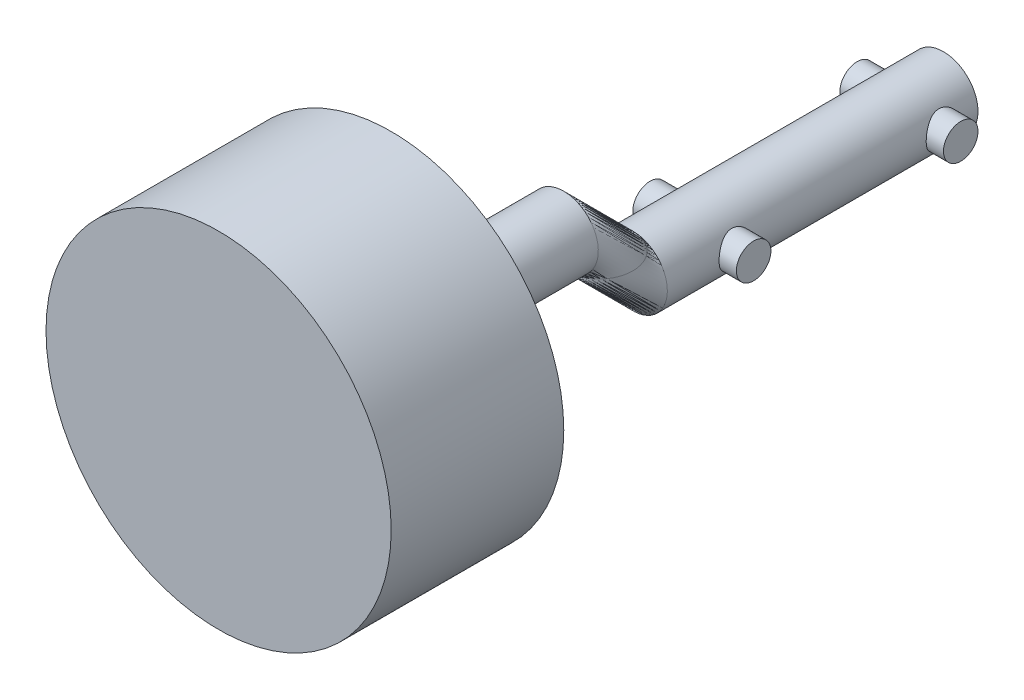
ISO-10303-21;
HEADER;
FILE_DESCRIPTION(('STEP AP214'),'2;1');
FILE_NAME('part.step','',(''),(''),'','','');
FILE_SCHEMA(('AUTOMOTIVE_DESIGN { 1 0 10303 214 1 1 1 1 }'));
ENDSEC;
DATA;
#1=APPLICATION_CONTEXT('core data for automotive mechanical design processes');
#2=APPLICATION_PROTOCOL_DEFINITION('international standard','automotive_design',2000,#1);
#3=PRODUCT_CONTEXT('',#1,'mechanical');
#4=PRODUCT('Part','Part','',(#3));
#5=PRODUCT_RELATED_PRODUCT_CATEGORY('part','',(#4));
#6=PRODUCT_DEFINITION_FORMATION('','',#4);
#7=PRODUCT_DEFINITION_CONTEXT('part definition',#1,'design');
#8=PRODUCT_DEFINITION('design','',#6,#7);
#9=PRODUCT_DEFINITION_SHAPE('','',#8);
#10=(LENGTH_UNIT() NAMED_UNIT(*) SI_UNIT(.MILLI.,.METRE.));
#11=(NAMED_UNIT(*) PLANE_ANGLE_UNIT() SI_UNIT($,.RADIAN.));
#12=(NAMED_UNIT(*) SI_UNIT($,.STERADIAN.) SOLID_ANGLE_UNIT());
#13=UNCERTAINTY_MEASURE_WITH_UNIT(LENGTH_MEASURE(1.E-05),#10,'distance_accuracy_value','');
#14=(GEOMETRIC_REPRESENTATION_CONTEXT(3) GLOBAL_UNCERTAINTY_ASSIGNED_CONTEXT((#13)) GLOBAL_UNIT_ASSIGNED_CONTEXT((#10,
#11,#12)) REPRESENTATION_CONTEXT('',''));
#15=CARTESIAN_POINT('',(0.,0.,0.));
#16=DIRECTION('',(0.,0.,1.));
#17=DIRECTION('',(1.,0.,0.));
#18=AXIS2_PLACEMENT_3D('',#15,#16,#17);
#19=CARTESIAN_POINT('',(0.,0.,10.));
#20=DIRECTION('',(0.,0.,-1.));
#21=DIRECTION('',(-1.,0.,0.));
#22=AXIS2_PLACEMENT_3D('',#19,#20,#21);
#23=CYLINDRICAL_SURFACE('',#22,10.);
#24=CARTESIAN_POINT('',(0.,0.,10.));
#25=DIRECTION('',(0.,0.,1.));
#26=DIRECTION('',(1.,0.,0.));
#27=AXIS2_PLACEMENT_3D('',#24,#25,#26);
#28=CIRCLE('',#27,10.);
#29=CARTESIAN_POINT('',(10.,0.,10.));
#30=VERTEX_POINT('',#29);
#31=EDGE_CURVE('E89',#30,#30,#28,.T.);
#32=ORIENTED_EDGE('',*,*,#31,.F.);
#33=EDGE_LOOP('',(#32));
#34=FACE_BOUND('',#33,.T.);
#35=CARTESIAN_POINT('',(0.,0.,0.));
#36=DIRECTION('',(0.,0.,1.));
#37=DIRECTION('',(1.,0.,0.));
#38=AXIS2_PLACEMENT_3D('',#35,#36,#37);
#39=CIRCLE('',#38,10.);
#40=CARTESIAN_POINT('',(10.,0.,0.));
#41=VERTEX_POINT('',#40);
#42=EDGE_CURVE('E85',#41,#41,#39,.T.);
#43=ORIENTED_EDGE('',*,*,#42,.T.);
#44=EDGE_LOOP('',(#43));
#45=FACE_BOUND('',#44,.T.);
#46=ADVANCED_FACE('F45',(#34,#45),#23,.T.);
#47=CARTESIAN_POINT('',(0.,0.,10.));
#48=DIRECTION('',(0.,0.,1.));
#49=DIRECTION('',(1.,0.,0.));
#50=AXIS2_PLACEMENT_3D('',#47,#48,#49);
#51=PLANE('',#50);
#52=ORIENTED_EDGE('',*,*,#31,.T.);
#53=EDGE_LOOP('',(#52));
#54=FACE_BOUND('',#53,.T.);
#55=ADVANCED_FACE('F129',(#54),#51,.T.);
#56=CARTESIAN_POINT('',(0.,0.,0.));
#57=DIRECTION('',(0.,0.,1.));
#58=DIRECTION('',(1.,0.,0.));
#59=AXIS2_PLACEMENT_3D('',#56,#57,#58);
#60=PLANE('',#59);
#61=CARTESIAN_POINT('',(0.,0.,0.));
#62=DIRECTION('',(0.,0.,-1.));
#63=DIRECTION('',(-1.,0.,0.));
#64=AXIS2_PLACEMENT_3D('',#61,#62,#63);
#65=CIRCLE('',#64,2.);
#66=CARTESIAN_POINT('',(-2.,0.,0.));
#67=VERTEX_POINT('',#66);
#68=EDGE_CURVE('E147',#67,#67,#65,.T.);
#69=ORIENTED_EDGE('',*,*,#68,.F.);
#70=EDGE_LOOP('',(#69));
#71=FACE_BOUND('',#70,.T.);
#72=ORIENTED_EDGE('',*,*,#42,.F.);
#73=EDGE_LOOP('',(#72));
#74=FACE_BOUND('',#73,.T.);
#75=ADVANCED_FACE('F127',(#71,#74),#60,.F.);
#76=CARTESIAN_POINT('',(0.,-4.,-32.));
#77=DIRECTION('',(0.,0.,-1.));
#78=DIRECTION('',(-1.,0.,0.));
#79=AXIS2_PLACEMENT_3D('',#76,#77,#78);
#80=PLANE('',#79);
#81=CARTESIAN_POINT('',(0.,-4.,-32.));
#82=DIRECTION('',(0.,0.,-1.));
#83=DIRECTION('',(-1.,0.,0.));
#84=AXIS2_PLACEMENT_3D('',#81,#82,#83);
#85=CIRCLE('',#84,2.);
#86=CARTESIAN_POINT('',(-2.,-4.,-32.));
#87=VERTEX_POINT('',#86);
#88=EDGE_CURVE('E61',#87,#87,#85,.T.);
#89=ORIENTED_EDGE('',*,*,#88,.T.);
#90=EDGE_LOOP('',(#89));
#91=FACE_BOUND('',#90,.T.);
#92=ADVANCED_FACE('F120',(#91),#80,.T.);
#93=CARTESIAN_POINT('',(0.,0.,0.));
#94=DIRECTION('',(0.,0.,-1.));
#95=DIRECTION('',(-1.,0.,0.));
#96=AXIS2_PLACEMENT_3D('',#93,#94,#95);
#97=CYLINDRICAL_SURFACE('',#96,2.);
#98=CARTESIAN_POINT('',(0.,0.,-10.));
#99=DIRECTION('',(0.,0.,-1.));
#100=DIRECTION('',(-1.,0.,0.));
#101=AXIS2_PLACEMENT_3D('',#98,#99,#100);
#102=CIRCLE('',#101,2.);
#103=CARTESIAN_POINT('',(0.,-2.,-10.));
#104=VERTEX_POINT('',#103);
#105=EDGE_CURVE('E66',#104,#104,#102,.T.);
#106=ORIENTED_EDGE('',*,*,#105,.F.);
#107=EDGE_LOOP('',(#106));
#108=FACE_BOUND('',#107,.T.);
#109=ORIENTED_EDGE('',*,*,#68,.T.);
#110=EDGE_LOOP('',(#109));
#111=FACE_BOUND('',#110,.T.);
#112=ADVANCED_FACE('F116',(#108,#111),#97,.T.);
#113=CARTESIAN_POINT('',(0.,-2.,-10.));
#114=DIRECTION('',(-1.,0.,0.));
#115=DIRECTION('',(0.,0.,1.));
#116=AXIS2_PLACEMENT_3D('',#113,#114,#115);
#117=DEGENERATE_TOROIDAL_SURFACE('',#116,2.,2.,.T.);
#118=CARTESIAN_POINT('',(0.,-2.,-12.));
#119=DIRECTION('',(0.,-1.,0.));
#120=DIRECTION('',(-1.,0.,0.));
#121=AXIS2_PLACEMENT_3D('',#118,#119,#120);
#122=CIRCLE('',#121,2.);
#123=CARTESIAN_POINT('',(0.,-2.,-14.));
#124=VERTEX_POINT('',#123);
#125=EDGE_CURVE('E75',#104,#124,#122,.T.);
#126=ORIENTED_EDGE('',*,*,#125,.F.);
#127=ORIENTED_EDGE('',*,*,#105,.T.);
#128=EDGE_CURVE('E72',#124,#104,#122,.T.);
#129=ORIENTED_EDGE('',*,*,#128,.F.);
#130=EDGE_LOOP('',(#126,#127,#129));
#131=FACE_BOUND('',#130,.T.);
#132=ADVANCED_FACE('F74',(#131),#117,.T.);
#133=CARTESIAN_POINT('',(0.,-2.,-14.));
#134=DIRECTION('',(1.,0.,0.));
#135=DIRECTION('',(0.,0.,-1.));
#136=AXIS2_PLACEMENT_3D('',#133,#134,#135);
#137=DEGENERATE_TOROIDAL_SURFACE('',#136,2.,2.,.T.);
#138=CARTESIAN_POINT('',(0.,-4.,-14.));
#139=DIRECTION('',(0.,0.,-1.));
#140=DIRECTION('',(-1.,0.,0.));
#141=AXIS2_PLACEMENT_3D('',#138,#139,#140);
#142=CIRCLE('',#141,2.);
#143=EDGE_CURVE('E81',#124,#124,#142,.T.);
#144=ORIENTED_EDGE('',*,*,#143,.F.);
#145=ORIENTED_EDGE('',*,*,#128,.T.);
#146=ORIENTED_EDGE('',*,*,#125,.T.);
#147=EDGE_LOOP('',(#144,#145,#146));
#148=FACE_BOUND('',#147,.T.);
#149=ADVANCED_FACE('F80',(#148),#137,.T.);
#150=CARTESIAN_POINT('',(0.,-4.,-14.));
#151=DIRECTION('',(0.,0.,-1.));
#152=DIRECTION('',(0.,1.,0.));
#153=AXIS2_PLACEMENT_3D('',#150,#151,#152);
#154=CYLINDRICAL_SURFACE('',#153,2.);
#155=CARTESIAN_POINT('',(-2.,-4.,-31.));
#156=CARTESIAN_POINT('',(-1.99999713404151,-4.05257196295299,-30.9999966976805));
#157=CARTESIAN_POINT('',(-1.99790491019518,-4.10520659969803,-30.9958299268783));
#158=CARTESIAN_POINT('',(-1.98974156037396,-4.20892023526843,-30.9793471196591));
#159=CARTESIAN_POINT('',(-1.98366287828984,-4.2599960867135,-30.9670156070023));
#160=CARTESIAN_POINT('',(-1.96816279403312,-4.35893354488058,-30.9348061913832));
#161=CARTESIAN_POINT('',(-1.9587543917752,-4.40680680293918,-30.914957615752));
#162=CARTESIAN_POINT('',(-1.93745776515779,-4.49847261680657,-30.8684293786351));
#163=CARTESIAN_POINT('',(-1.9255697363353,-4.54226549399005,-30.8417502557511));
#164=CARTESIAN_POINT('',(-1.89956258258057,-4.62750781776192,-30.7804827505147));
#165=CARTESIAN_POINT('',(-1.88535199127536,-4.66865521112211,-30.7455135207604));
#166=CARTESIAN_POINT('',(-1.85659970246744,-4.74477944486698,-30.669478520753));
#167=CARTESIAN_POINT('',(-1.84205776209035,-4.77975158310677,-30.6284081482276));
#168=CARTESIAN_POINT('',(-1.81298951197347,-4.84525200045028,-30.5375166504766));
#169=CARTESIAN_POINT('',(-1.79855186970132,-4.87522533555164,-30.4872639016541));
#170=CARTESIAN_POINT('',(-1.77285978772321,-4.9261682268907,-30.3816326640138));
#171=CARTESIAN_POINT('',(-1.7616030760699,-4.94714421496634,-30.3262578712772));
#172=CARTESIAN_POINT('',(-1.74457867037808,-4.97813244218859,-30.2153348945781));
#173=CARTESIAN_POINT('',(-1.73852271583713,-4.98872585708044,-30.1599955479326));
#174=CARTESIAN_POINT('',(-1.73181889948528,-5.00042699330885,-30.0480211622205));
#175=CARTESIAN_POINT('',(-1.73116569343288,-5.00154408837308,-29.9913874591288));
#176=CARTESIAN_POINT('',(-1.73510930257248,-4.99468728717229,-29.8857139756846));
#177=CARTESIAN_POINT('',(-1.73908763662013,-4.98778455953682,-29.8365759687769));
#178=CARTESIAN_POINT('',(-1.7507622873385,-4.96693984905693,-29.740278090627));
#179=CARTESIAN_POINT('',(-1.75845978831776,-4.95299562389765,-29.6931188546947));
#180=CARTESIAN_POINT('',(-1.77687476412741,-4.91820978038601,-29.6007708674343));
#181=CARTESIAN_POINT('',(-1.78765840663998,-4.897215067116,-29.5556536012142));
#182=CARTESIAN_POINT('',(-1.81103404281404,-4.849041687668,-29.46936570741));
#183=CARTESIAN_POINT('',(-1.82362684780191,-4.82186024381247,-29.4281968643999));
#184=CARTESIAN_POINT('',(-1.85113157903286,-4.75806605491279,-29.3454787472568));
#185=CARTESIAN_POINT('',(-1.86613510236746,-4.72069445836928,-29.3045431264238));
#186=CARTESIAN_POINT('',(-1.89547623300407,-4.63955557874137,-29.2292645814091));
#187=CARTESIAN_POINT('',(-1.90981351958801,-4.59578525657429,-29.1949248079661));
#188=CARTESIAN_POINT('',(-1.93701987282964,-4.50051650583185,-29.1323143389703));
#189=CARTESIAN_POINT('',(-1.94978984162007,-4.44875359159941,-29.1043995275543));
#190=CARTESIAN_POINT('',(-1.97157881121242,-4.3404662154888,-29.057902970957));
#191=CARTESIAN_POINT('',(-1.98060078943553,-4.28394557626528,-29.0393138149848));
#192=CARTESIAN_POINT('',(-1.99324333741436,-4.1727664916607,-29.0135245962833));
#193=CARTESIAN_POINT('',(-1.99724938301312,-4.11834153054833,-29.0055087642532));
#194=CARTESIAN_POINT('',(-2.00073013459102,-4.00877959994936,-28.9985352688655));
#195=CARTESIAN_POINT('',(-2.00020698721312,-3.9536429801301,-28.9995733143605));
#196=CARTESIAN_POINT('',(-1.99491192253441,-3.84876702801401,-29.0102066884187));
#197=CARTESIAN_POINT('',(-1.9904724568819,-3.79894059195005,-29.01913253273));
#198=CARTESIAN_POINT('',(-1.97822171314819,-3.70159310769808,-29.0442380718951));
#199=CARTESIAN_POINT('',(-1.97041006334332,-3.654072314309,-29.0604185664534));
#200=CARTESIAN_POINT('',(-1.95184251413669,-3.56111139155033,-29.0999984664332));
#201=CARTESIAN_POINT('',(-1.94100881769939,-3.51576960299385,-29.1235910501168));
#202=CARTESIAN_POINT('',(-1.91743974317109,-3.42953863830108,-29.177107535646));
#203=CARTESIAN_POINT('',(-1.90470355565785,-3.38865137022472,-29.2070341345934));
#204=CARTESIAN_POINT('',(-1.87708221337464,-3.30823231070935,-29.2757604253329));
#205=CARTESIAN_POINT('',(-1.86210884848441,-3.26922792217536,-29.3151428684536));
#206=CARTESIAN_POINT('',(-1.83262391603874,-3.19814367888676,-29.3999251512693));
#207=CARTESIAN_POINT('',(-1.81811267381526,-3.16606861430916,-29.4453291188164));
#208=CARTESIAN_POINT('',(-1.79051192226068,-3.1082920855023,-29.5436436542003));
#209=CARTESIAN_POINT('',(-1.77752529663472,-3.08297450412136,-29.5968112662086));
#210=CARTESIAN_POINT('',(-1.75574072368126,-3.0419171739862,-29.7075100676925));
#211=CARTESIAN_POINT('',(-1.74693738240618,-3.02616508411243,-29.7650355265012));
#212=CARTESIAN_POINT('',(-1.73561501008667,-3.00613831255032,-29.8769102228614));
#213=CARTESIAN_POINT('',(-1.73257383460491,-3.00090700359913,-29.931034253429));
#214=CARTESIAN_POINT('',(-1.73165354646175,-2.99931084561921,-30.0394470671707));
#215=CARTESIAN_POINT('',(-1.73377219627552,-3.0029421533756,-30.0937357687394));
#216=CARTESIAN_POINT('',(-1.74237862050025,-3.01807387440774,-30.195483501532));
#217=CARTESIAN_POINT('',(-1.74843094482393,-3.0287916856572,-30.2431004701444));
#218=CARTESIAN_POINT('',(-1.76371016187917,-3.05682464177535,-30.3358081194247));
#219=CARTESIAN_POINT('',(-1.77293807569675,-3.07414190884019,-30.380897982092));
#220=CARTESIAN_POINT('',(-1.79428530364528,-3.11618425469932,-30.4706248509866));
#221=CARTESIAN_POINT('',(-1.8065572239619,-3.14132886218354,-30.5150279018297));
#222=CARTESIAN_POINT('',(-1.8323533163459,-3.19784902836336,-30.5992745361806));
#223=CARTESIAN_POINT('',(-1.84587813794522,-3.22922782876135,-30.6391157305185));
#224=CARTESIAN_POINT('',(-1.87462323159313,-3.30179667333536,-30.7181419823576));
#225=CARTESIAN_POINT('',(-1.88984983311468,-3.34371557698983,-30.7566591023619));
#226=CARTESIAN_POINT('',(-1.91877752255088,-3.43384519377972,-30.8262629834236));
#227=CARTESIAN_POINT('',(-1.9324777860804,-3.48205927674321,-30.8573457394263));
#228=CARTESIAN_POINT('',(-1.95698009585103,-3.58406840318005,-30.9112363627622));
#229=CARTESIAN_POINT('',(-1.96776096562909,-3.63790049606538,-30.9339841694114));
#230=CARTESIAN_POINT('',(-1.98501341363465,-3.74925789870581,-30.969808167919));
#231=CARTESIAN_POINT('',(-1.99149723372932,-3.80677220037683,-30.9829118468296));
#232=CARTESIAN_POINT('',(-1.99695461909663,-3.88739805351662,-30.9938974110758));
#233=CARTESIAN_POINT('',(-1.99809365339202,-3.9098381205605,-30.9961826408636));
#234=CARTESIAN_POINT('',(-1.99961696977865,-3.95484826819284,-30.9992346655168));
#235=CARTESIAN_POINT('',(-2.00000123103763,-3.97741835235262,-31.0000014184712));
#236=CARTESIAN_POINT('',(-2.,-4.,-31.));
#237=B_SPLINE_CURVE_WITH_KNOTS('',3,(#155,#156,#157,#158,#159,#160,#161,#162,#163,#164,#165,
#166,#167,#168,#169,#170,#171,#172,#173,#174,#175,#176,#177,#178,#179,#180,#181,#182,#183,#184,
#185,#186,#187,#188,#189,#190,#191,#192,#193,#194,#195,#196,#197,#198,#199,#200,#201,#202,#203,
#204,#205,#206,#207,#208,#209,#210,#211,#212,#213,#214,#215,#216,#217,#218,#219,#220,#221,#222,
#223,#224,#225,#226,#227,#228,#229,#230,#231,#232,#233,#234,#235,#236),.UNSPECIFIED.,.T.,.F.,(4,
2,2,2,2,2,2,2,2,2,2,2,2,2,2,2,2,2,2,2,2,2,2,2,2,2,2,2,2,2,2,2,2,2,2,2,2,2,2,2,4),(0.,
0.157624257420294,0.315548149709198,0.472862155492299,0.63016376058157,0.796981758718092,
0.963926237654039,1.14381726430753,1.32357947898281,1.4925801214023,1.66141357329021,
1.81005712409321,1.95874803925679,2.11090240168487,2.26312521260222,2.43464941333879,
2.60625534598687,2.78583022214441,2.9652621691228,3.12983290471346,3.29432564511476,
3.44606906506122,3.59782921630932,3.75392856027899,3.91009450748339,4.08159610644419,
4.25321588615432,4.43314682159674,4.61284511940778,4.77529307498374,4.93767059860006,
5.08457930244183,5.23153528783679,5.38836456775615,5.54527561138958,5.72125242752499,
5.89732383376573,6.07464013662926,6.25144908624931,6.31915280137698,6.38685838514848),.UNSPECIFIED.);
#238=CARTESIAN_POINT('',(-2.,-4.,-31.));
#239=VERTEX_POINT('',#238);
#240=EDGE_CURVE('E13',#239,#239,#237,.T.);
#241=ORIENTED_EDGE('',*,*,#240,.F.);
#242=EDGE_LOOP('',(#241));
#243=FACE_BOUND('',#242,.T.);
#244=CARTESIAN_POINT('',(2.,-4.,-31.));
#245=CARTESIAN_POINT('',(1.99999713404151,-3.94742803704701,-30.9999966976805));
#246=CARTESIAN_POINT('',(1.99790491019518,-3.89479340030197,-30.9958299268783));
#247=CARTESIAN_POINT('',(1.98974156037396,-3.79107976473157,-30.9793471196591));
#248=CARTESIAN_POINT('',(1.98366287828984,-3.7400039132865,-30.9670156070023));
#249=CARTESIAN_POINT('',(1.96816279403312,-3.64106645511942,-30.9348061913832));
#250=CARTESIAN_POINT('',(1.9587543917752,-3.59319319706082,-30.914957615752));
#251=CARTESIAN_POINT('',(1.93745776515778,-3.50152738319343,-30.8684293786351));
#252=CARTESIAN_POINT('',(1.9255697363353,-3.45773450600995,-30.8417502557511));
#253=CARTESIAN_POINT('',(1.89956258258057,-3.37249218223808,-30.7804827505147));
#254=CARTESIAN_POINT('',(1.88535199127536,-3.33134478887789,-30.7455135207604));
#255=CARTESIAN_POINT('',(1.85659970246744,-3.25522055513302,-30.669478520753));
#256=CARTESIAN_POINT('',(1.84205776209035,-3.22024841689323,-30.6284081482276));
#257=CARTESIAN_POINT('',(1.81298951197347,-3.15474799954972,-30.5375166504766));
#258=CARTESIAN_POINT('',(1.79855186970132,-3.12477466444836,-30.4872639016541));
#259=CARTESIAN_POINT('',(1.77285978772321,-3.0738317731093,-30.3816326640138));
#260=CARTESIAN_POINT('',(1.7616030760699,-3.05285578503367,-30.3262578712772));
#261=CARTESIAN_POINT('',(1.74457867037808,-3.02186755781141,-30.2153348945781));
#262=CARTESIAN_POINT('',(1.73852271583713,-3.01127414291956,-30.1599955479326));
#263=CARTESIAN_POINT('',(1.73181889948528,-2.99957300669115,-30.0480211622205));
#264=CARTESIAN_POINT('',(1.73116569343288,-2.99845591162692,-29.9913874591288));
#265=CARTESIAN_POINT('',(1.73510930257248,-3.0053127128277,-29.8857139756846));
#266=CARTESIAN_POINT('',(1.73908763662013,-3.01221544046318,-29.836575968777));
#267=CARTESIAN_POINT('',(1.7507622873385,-3.03306015094306,-29.740278090627));
#268=CARTESIAN_POINT('',(1.75845978831776,-3.04700437610235,-29.6931188546947));
#269=CARTESIAN_POINT('',(1.77687476412741,-3.08179021961399,-29.6007708674343));
#270=CARTESIAN_POINT('',(1.78765840663998,-3.102784932884,-29.5556536012142));
#271=CARTESIAN_POINT('',(1.81103404281403,-3.150958312332,-29.46936570741));
#272=CARTESIAN_POINT('',(1.8236268478019,-3.17813975618753,-29.4281968643999));
#273=CARTESIAN_POINT('',(1.85113157903286,-3.24193394508721,-29.3454787472568));
#274=CARTESIAN_POINT('',(1.86613510236746,-3.27930554163072,-29.3045431264238));
#275=CARTESIAN_POINT('',(1.89547623300407,-3.36044442125863,-29.2292645814091));
#276=CARTESIAN_POINT('',(1.90981351958801,-3.40421474342571,-29.1949248079661));
#277=CARTESIAN_POINT('',(1.93701987282964,-3.49948349416815,-29.1323143389703));
#278=CARTESIAN_POINT('',(1.94978984162007,-3.55124640840059,-29.1043995275543));
#279=CARTESIAN_POINT('',(1.97157881121242,-3.6595337845112,-29.057902970957));
#280=CARTESIAN_POINT('',(1.98060078943553,-3.71605442373472,-29.0393138149848));
#281=CARTESIAN_POINT('',(1.99324333741436,-3.8272335083393,-29.0135245962833));
#282=CARTESIAN_POINT('',(1.99724938301312,-3.88165846945167,-29.0055087642532));
#283=CARTESIAN_POINT('',(2.00073013459102,-3.99122040005064,-28.9985352688655));
#284=CARTESIAN_POINT('',(2.00020698721312,-4.0463570198699,-28.9995733143605));
#285=CARTESIAN_POINT('',(1.99491192253441,-4.15123297198599,-29.0102066884187));
#286=CARTESIAN_POINT('',(1.9904724568819,-4.20105940804995,-29.01913253273));
#287=CARTESIAN_POINT('',(1.97822171314819,-4.29840689230192,-29.0442380718951));
#288=CARTESIAN_POINT('',(1.97041006334333,-4.345927685691,-29.0604185664534));
#289=CARTESIAN_POINT('',(1.9518425141367,-4.43888860844966,-29.0999984664332));
#290=CARTESIAN_POINT('',(1.94100881769939,-4.48423039700615,-29.1235910501168));
#291=CARTESIAN_POINT('',(1.91743974317109,-4.57046136169892,-29.177107535646));
#292=CARTESIAN_POINT('',(1.90470355565785,-4.61134862977528,-29.2070341345934));
#293=CARTESIAN_POINT('',(1.87708221337464,-4.69176768929065,-29.2757604253329));
#294=CARTESIAN_POINT('',(1.86210884848441,-4.73077207782464,-29.3151428684536));
#295=CARTESIAN_POINT('',(1.83262391603874,-4.80185632111324,-29.3999251512693));
#296=CARTESIAN_POINT('',(1.81811267381526,-4.83393138569084,-29.4453291188164));
#297=CARTESIAN_POINT('',(1.79051192226068,-4.8917079144977,-29.5436436542003));
#298=CARTESIAN_POINT('',(1.77752529663472,-4.91702549587864,-29.5968112662086));
#299=CARTESIAN_POINT('',(1.75574072368126,-4.9580828260138,-29.7075100676925));
#300=CARTESIAN_POINT('',(1.74693738240618,-4.97383491588757,-29.7650355265012));
#301=CARTESIAN_POINT('',(1.73561501008667,-4.99386168744968,-29.8769102228614));
#302=CARTESIAN_POINT('',(1.73257383460491,-4.99909299640087,-29.931034253429));
#303=CARTESIAN_POINT('',(1.73165354646175,-5.00068915438079,-30.0394470671707));
#304=CARTESIAN_POINT('',(1.73377219627553,-4.9970578466244,-30.0937357687394));
#305=CARTESIAN_POINT('',(1.74237862050025,-4.98192612559226,-30.195483501532));
#306=CARTESIAN_POINT('',(1.74843094482394,-4.9712083143428,-30.2431004701444));
#307=CARTESIAN_POINT('',(1.76371016187917,-4.94317535822465,-30.3358081194247));
#308=CARTESIAN_POINT('',(1.77293807569676,-4.92585809115981,-30.380897982092));
#309=CARTESIAN_POINT('',(1.79428530364528,-4.88381574530068,-30.4706248509866));
#310=CARTESIAN_POINT('',(1.8065572239619,-4.85867113781646,-30.5150279018297));
#311=CARTESIAN_POINT('',(1.8323533163459,-4.80215097163664,-30.5992745361806));
#312=CARTESIAN_POINT('',(1.84587813794522,-4.77077217123865,-30.6391157305185));
#313=CARTESIAN_POINT('',(1.87462323159313,-4.69820332666465,-30.7181419823576));
#314=CARTESIAN_POINT('',(1.88984983311468,-4.65628442301017,-30.7566591023619));
#315=CARTESIAN_POINT('',(1.91877752255088,-4.56615480622028,-30.8262629834236));
#316=CARTESIAN_POINT('',(1.9324777860804,-4.51794072325679,-30.8573457394263));
#317=CARTESIAN_POINT('',(1.95698009585103,-4.41593159681995,-30.9112363627622));
#318=CARTESIAN_POINT('',(1.96776096562909,-4.36209950393462,-30.9339841694114));
#319=CARTESIAN_POINT('',(1.98501341363465,-4.25074210129419,-30.969808167919));
#320=CARTESIAN_POINT('',(1.99149723372932,-4.19322779962317,-30.9829118468296));
#321=CARTESIAN_POINT('',(1.99695461909663,-4.11260194648339,-30.9938974110758));
#322=CARTESIAN_POINT('',(1.99809365339202,-4.0901618794395,-30.9961826408636));
#323=CARTESIAN_POINT('',(1.99961696977865,-4.04515173180716,-30.9992346655168));
#324=CARTESIAN_POINT('',(2.00000123103763,-4.02258164764738,-31.0000014184712));
#325=CARTESIAN_POINT('',(2.,-4.,-31.));
#326=B_SPLINE_CURVE_WITH_KNOTS('',3,(#244,#245,#246,#247,#248,#249,#250,#251,#252,#253,#254,
#255,#256,#257,#258,#259,#260,#261,#262,#263,#264,#265,#266,#267,#268,#269,#270,#271,#272,#273,
#274,#275,#276,#277,#278,#279,#280,#281,#282,#283,#284,#285,#286,#287,#288,#289,#290,#291,#292,
#293,#294,#295,#296,#297,#298,#299,#300,#301,#302,#303,#304,#305,#306,#307,#308,#309,#310,#311,
#312,#313,#314,#315,#316,#317,#318,#319,#320,#321,#322,#323,#324,#325),.UNSPECIFIED.,.T.,.F.,(4,
2,2,2,2,2,2,2,2,2,2,2,2,2,2,2,2,2,2,2,2,2,2,2,2,2,2,2,2,2,2,2,2,2,2,2,2,2,2,2,4),(0.,
0.157624257420294,0.315548149709198,0.472862155492299,0.630163760581569,0.79698175871809,
0.963926237654039,1.14381726430753,1.32357947898281,1.49258012140229,1.6614135732902,
1.8100571240932,1.95874803925678,2.11090240168487,2.26312521260222,2.43464941333879,
2.60625534598687,2.78583022214441,2.9652621691228,3.12983290471346,3.29432564511476,
3.44606906506122,3.59782921630932,3.75392856027899,3.9100945074834,4.08159610644419,
4.25321588615432,4.43314682159675,4.61284511940778,4.77529307498375,4.93767059860006,
5.08457930244184,5.23153528783679,5.38836456775615,5.54527561138958,5.72125242752499,
5.89732383376573,6.07464013662926,6.25144908624931,6.31915280137698,6.38685838514848),.UNSPECIFIED.);
#327=CARTESIAN_POINT('',(2.,-4.,-31.));
#328=VERTEX_POINT('',#327);
#329=EDGE_CURVE('E56',#328,#328,#326,.T.);
#330=ORIENTED_EDGE('',*,*,#329,.F.);
#331=EDGE_LOOP('',(#330));
#332=FACE_BOUND('',#331,.T.);
#333=CARTESIAN_POINT('',(-2.,-4.,-19.));
#334=CARTESIAN_POINT('',(-1.99999713404151,-4.05257196295299,-18.9999966976805));
#335=CARTESIAN_POINT('',(-1.99790491019518,-4.10520659969803,-18.9958299268783));
#336=CARTESIAN_POINT('',(-1.98974156037396,-4.20892023526843,-18.9793471196591));
#337=CARTESIAN_POINT('',(-1.98366287828984,-4.2599960867135,-18.9670156070023));
#338=CARTESIAN_POINT('',(-1.96816279403312,-4.35893354488058,-18.9348061913832));
#339=CARTESIAN_POINT('',(-1.9587543917752,-4.40680680293918,-18.914957615752));
#340=CARTESIAN_POINT('',(-1.93745776515779,-4.49847261680657,-18.8684293786351));
#341=CARTESIAN_POINT('',(-1.9255697363353,-4.54226549399005,-18.8417502557511));
#342=CARTESIAN_POINT('',(-1.89956258258057,-4.62750781776192,-18.7804827505147));
#343=CARTESIAN_POINT('',(-1.88535199127536,-4.66865521112211,-18.7455135207604));
#344=CARTESIAN_POINT('',(-1.85659970246744,-4.74477944486698,-18.669478520753));
#345=CARTESIAN_POINT('',(-1.84205776209035,-4.77975158310677,-18.6284081482276));
#346=CARTESIAN_POINT('',(-1.81298951197347,-4.84525200045028,-18.5375166504766));
#347=CARTESIAN_POINT('',(-1.79855186970132,-4.87522533555164,-18.4872639016541));
#348=CARTESIAN_POINT('',(-1.7728597877232,-4.9261682268907,-18.3816326640138));
#349=CARTESIAN_POINT('',(-1.76160307606989,-4.94714421496634,-18.3262578712772));
#350=CARTESIAN_POINT('',(-1.74457867037808,-4.97813244218859,-18.2153348945781));
#351=CARTESIAN_POINT('',(-1.73852271583713,-4.98872585708044,-18.1599955479326));
#352=CARTESIAN_POINT('',(-1.73181889948528,-5.00042699330885,-18.0480211622205));
#353=CARTESIAN_POINT('',(-1.73116569343288,-5.00154408837308,-17.9913874591288));
#354=CARTESIAN_POINT('',(-1.73510930257248,-4.9946872871723,-17.8857139756846));
#355=CARTESIAN_POINT('',(-1.73908763662013,-4.98778455953682,-17.836575968777));
#356=CARTESIAN_POINT('',(-1.7507622873385,-4.96693984905693,-17.740278090627));
#357=CARTESIAN_POINT('',(-1.75845978831776,-4.95299562389765,-17.6931188546947));
#358=CARTESIAN_POINT('',(-1.77687476412741,-4.91820978038601,-17.6007708674343));
#359=CARTESIAN_POINT('',(-1.78765840663998,-4.897215067116,-17.5556536012142));
#360=CARTESIAN_POINT('',(-1.81103404281404,-4.849041687668,-17.46936570741));
#361=CARTESIAN_POINT('',(-1.82362684780191,-4.82186024381247,-17.4281968643999));
#362=CARTESIAN_POINT('',(-1.85113157903286,-4.75806605491279,-17.3454787472568));
#363=CARTESIAN_POINT('',(-1.86613510236746,-4.72069445836928,-17.3045431264238));
#364=CARTESIAN_POINT('',(-1.89547623300407,-4.63955557874138,-17.2292645814091));
#365=CARTESIAN_POINT('',(-1.90981351958801,-4.59578525657429,-17.1949248079661));
#366=CARTESIAN_POINT('',(-1.93701987282964,-4.50051650583185,-17.1323143389703));
#367=CARTESIAN_POINT('',(-1.94978984162007,-4.44875359159941,-17.1043995275543));
#368=CARTESIAN_POINT('',(-1.97157881121242,-4.3404662154888,-17.057902970957));
#369=CARTESIAN_POINT('',(-1.98060078943553,-4.28394557626528,-17.0393138149848));
#370=CARTESIAN_POINT('',(-1.99324333741436,-4.17276649166071,-17.0135245962833));
#371=CARTESIAN_POINT('',(-1.99724938301312,-4.11834153054833,-17.0055087642532));
#372=CARTESIAN_POINT('',(-2.00073013459102,-4.00877959994936,-16.9985352688655));
#373=CARTESIAN_POINT('',(-2.00020698721312,-3.9536429801301,-16.9995733143605));
#374=CARTESIAN_POINT('',(-1.99491192253441,-3.84876702801401,-17.0102066884187));
#375=CARTESIAN_POINT('',(-1.9904724568819,-3.79894059195005,-17.01913253273));
#376=CARTESIAN_POINT('',(-1.97822171314819,-3.70159310769808,-17.0442380718951));
#377=CARTESIAN_POINT('',(-1.97041006334332,-3.654072314309,-17.0604185664534));
#378=CARTESIAN_POINT('',(-1.95184251413669,-3.56111139155034,-17.0999984664332));
#379=CARTESIAN_POINT('',(-1.94100881769939,-3.51576960299385,-17.1235910501168));
#380=CARTESIAN_POINT('',(-1.91743974317109,-3.42953863830108,-17.177107535646));
#381=CARTESIAN_POINT('',(-1.90470355565785,-3.38865137022472,-17.2070341345934));
#382=CARTESIAN_POINT('',(-1.87708221337464,-3.30823231070935,-17.2757604253329));
#383=CARTESIAN_POINT('',(-1.86210884848441,-3.26922792217536,-17.3151428684536));
#384=CARTESIAN_POINT('',(-1.83262391603874,-3.19814367888676,-17.3999251512693));
#385=CARTESIAN_POINT('',(-1.81811267381526,-3.16606861430916,-17.4453291188164));
#386=CARTESIAN_POINT('',(-1.79051192226068,-3.1082920855023,-17.5436436542003));
#387=CARTESIAN_POINT('',(-1.77752529663472,-3.08297450412136,-17.5968112662086));
#388=CARTESIAN_POINT('',(-1.75574072368126,-3.0419171739862,-17.7075100676925));
#389=CARTESIAN_POINT('',(-1.74693738240618,-3.02616508411243,-17.7650355265012));
#390=CARTESIAN_POINT('',(-1.73561501008667,-3.00613831255032,-17.8769102228614));
#391=CARTESIAN_POINT('',(-1.73257383460491,-3.00090700359913,-17.931034253429));
#392=CARTESIAN_POINT('',(-1.73165354646175,-2.99931084561921,-18.0394470671707));
#393=CARTESIAN_POINT('',(-1.73377219627552,-3.0029421533756,-18.0937357687394));
#394=CARTESIAN_POINT('',(-1.74237862050025,-3.01807387440773,-18.195483501532));
#395=CARTESIAN_POINT('',(-1.74843094482393,-3.0287916856572,-18.2431004701444));
#396=CARTESIAN_POINT('',(-1.76371016187917,-3.05682464177535,-18.3358081194247));
#397=CARTESIAN_POINT('',(-1.77293807569675,-3.07414190884019,-18.380897982092));
#398=CARTESIAN_POINT('',(-1.79428530364528,-3.11618425469931,-18.4706248509866));
#399=CARTESIAN_POINT('',(-1.8065572239619,-3.14132886218354,-18.5150279018297));
#400=CARTESIAN_POINT('',(-1.8323533163459,-3.19784902836336,-18.5992745361806));
#401=CARTESIAN_POINT('',(-1.84587813794522,-3.22922782876135,-18.6391157305185));
#402=CARTESIAN_POINT('',(-1.87462323159313,-3.30179667333535,-18.7181419823576));
#403=CARTESIAN_POINT('',(-1.88984983311468,-3.34371557698983,-18.7566591023619));
#404=CARTESIAN_POINT('',(-1.91877752255088,-3.43384519377972,-18.8262629834236));
#405=CARTESIAN_POINT('',(-1.9324777860804,-3.48205927674321,-18.8573457394263));
#406=CARTESIAN_POINT('',(-1.95698009585103,-3.58406840318005,-18.9112363627622));
#407=CARTESIAN_POINT('',(-1.96776096562909,-3.63790049606538,-18.9339841694114));
#408=CARTESIAN_POINT('',(-1.98501341363465,-3.74925789870581,-18.969808167919));
#409=CARTESIAN_POINT('',(-1.99149723372932,-3.80677220037683,-18.9829118468296));
#410=CARTESIAN_POINT('',(-1.99695461909663,-3.88739805351661,-18.9938974110758));
#411=CARTESIAN_POINT('',(-1.99809365339202,-3.9098381205605,-18.9961826408636));
#412=CARTESIAN_POINT('',(-1.99961696977865,-3.95484826819284,-18.9992346655168));
#413=CARTESIAN_POINT('',(-2.00000123103763,-3.97741835235262,-19.0000014184712));
#414=CARTESIAN_POINT('',(-2.,-4.,-19.));
#415=B_SPLINE_CURVE_WITH_KNOTS('',3,(#333,#334,#335,#336,#337,#338,#339,#340,#341,#342,#343,
#344,#345,#346,#347,#348,#349,#350,#351,#352,#353,#354,#355,#356,#357,#358,#359,#360,#361,#362,
#363,#364,#365,#366,#367,#368,#369,#370,#371,#372,#373,#374,#375,#376,#377,#378,#379,#380,#381,
#382,#383,#384,#385,#386,#387,#388,#389,#390,#391,#392,#393,#394,#395,#396,#397,#398,#399,#400,
#401,#402,#403,#404,#405,#406,#407,#408,#409,#410,#411,#412,#413,#414),.UNSPECIFIED.,.T.,.F.,(4,
2,2,2,2,2,2,2,2,2,2,2,2,2,2,2,2,2,2,2,2,2,2,2,2,2,2,2,2,2,2,2,2,2,2,2,2,2,2,2,4),(0.,
0.157624257420293,0.315548149709198,0.472862155492299,0.63016376058157,0.796981758718092,
0.963926237654039,1.14381726430753,1.32357947898281,1.4925801214023,1.6614135732902,
1.8100571240932,1.95874803925678,2.11090240168488,2.26312521260222,2.43464941333879,
2.60625534598687,2.78583022214441,2.9652621691228,3.12983290471346,3.29432564511476,
3.44606906506122,3.59782921630932,3.75392856027899,3.91009450748339,4.08159610644419,
4.25321588615432,4.43314682159674,4.61284511940778,4.77529307498374,4.93767059860006,
5.08457930244183,5.23153528783678,5.38836456775614,5.54527561138958,5.72125242752499,
5.89732383376573,6.07464013662925,6.25144908624931,6.31915280137698,6.38685838514847),.UNSPECIFIED.);
#416=CARTESIAN_POINT('',(-2.,-4.,-19.));
#417=VERTEX_POINT('',#416);
#418=EDGE_CURVE('E100',#417,#417,#415,.T.);
#419=ORIENTED_EDGE('',*,*,#418,.F.);
#420=EDGE_LOOP('',(#419));
#421=FACE_BOUND('',#420,.T.);
#422=CARTESIAN_POINT('',(2.,-4.,-19.));
#423=CARTESIAN_POINT('',(1.99999713404151,-3.94742803704701,-18.9999966976805));
#424=CARTESIAN_POINT('',(1.99790491019518,-3.89479340030197,-18.9958299268783));
#425=CARTESIAN_POINT('',(1.98974156037396,-3.79107976473157,-18.9793471196591));
#426=CARTESIAN_POINT('',(1.98366287828984,-3.7400039132865,-18.9670156070023));
#427=CARTESIAN_POINT('',(1.96816279403312,-3.64106645511942,-18.9348061913832));
#428=CARTESIAN_POINT('',(1.9587543917752,-3.59319319706082,-18.914957615752));
#429=CARTESIAN_POINT('',(1.93745776515779,-3.50152738319343,-18.8684293786351));
#430=CARTESIAN_POINT('',(1.9255697363353,-3.45773450600995,-18.8417502557511));
#431=CARTESIAN_POINT('',(1.89956258258057,-3.37249218223808,-18.7804827505147));
#432=CARTESIAN_POINT('',(1.88535199127536,-3.33134478887789,-18.7455135207604));
#433=CARTESIAN_POINT('',(1.85659970246744,-3.25522055513302,-18.669478520753));
#434=CARTESIAN_POINT('',(1.84205776209035,-3.22024841689323,-18.6284081482276));
#435=CARTESIAN_POINT('',(1.81298951197347,-3.15474799954972,-18.5375166504766));
#436=CARTESIAN_POINT('',(1.79855186970132,-3.12477466444836,-18.4872639016541));
#437=CARTESIAN_POINT('',(1.77285978772321,-3.0738317731093,-18.3816326640138));
#438=CARTESIAN_POINT('',(1.7616030760699,-3.05285578503367,-18.3262578712772));
#439=CARTESIAN_POINT('',(1.74457867037808,-3.02186755781141,-18.2153348945781));
#440=CARTESIAN_POINT('',(1.73852271583713,-3.01127414291956,-18.1599955479326));
#441=CARTESIAN_POINT('',(1.73181889948528,-2.99957300669115,-18.0480211622205));
#442=CARTESIAN_POINT('',(1.73116569343288,-2.99845591162692,-17.9913874591288));
#443=CARTESIAN_POINT('',(1.73510930257248,-3.0053127128277,-17.8857139756846));
#444=CARTESIAN_POINT('',(1.73908763662013,-3.01221544046318,-17.836575968777));
#445=CARTESIAN_POINT('',(1.7507622873385,-3.03306015094306,-17.740278090627));
#446=CARTESIAN_POINT('',(1.75845978831776,-3.04700437610235,-17.6931188546947));
#447=CARTESIAN_POINT('',(1.77687476412741,-3.08179021961399,-17.6007708674343));
#448=CARTESIAN_POINT('',(1.78765840663998,-3.102784932884,-17.5556536012142));
#449=CARTESIAN_POINT('',(1.81103404281404,-3.150958312332,-17.46936570741));
#450=CARTESIAN_POINT('',(1.82362684780191,-3.17813975618753,-17.4281968643999));
#451=CARTESIAN_POINT('',(1.85113157903286,-3.24193394508721,-17.3454787472568));
#452=CARTESIAN_POINT('',(1.86613510236746,-3.27930554163072,-17.3045431264238));
#453=CARTESIAN_POINT('',(1.89547623300407,-3.36044442125863,-17.2292645814091));
#454=CARTESIAN_POINT('',(1.90981351958801,-3.40421474342571,-17.1949248079661));
#455=CARTESIAN_POINT('',(1.93701987282964,-3.49948349416815,-17.1323143389703));
#456=CARTESIAN_POINT('',(1.94978984162007,-3.55124640840059,-17.1043995275543));
#457=CARTESIAN_POINT('',(1.97157881121242,-3.6595337845112,-17.057902970957));
#458=CARTESIAN_POINT('',(1.98060078943553,-3.71605442373472,-17.0393138149848));
#459=CARTESIAN_POINT('',(1.99324333741436,-3.8272335083393,-17.0135245962833));
#460=CARTESIAN_POINT('',(1.99724938301312,-3.88165846945167,-17.0055087642532));
#461=CARTESIAN_POINT('',(2.00073013459102,-3.99122040005064,-16.9985352688655));
#462=CARTESIAN_POINT('',(2.00020698721312,-4.0463570198699,-16.9995733143605));
#463=CARTESIAN_POINT('',(1.99491192253441,-4.15123297198599,-17.0102066884187));
#464=CARTESIAN_POINT('',(1.9904724568819,-4.20105940804995,-17.01913253273));
#465=CARTESIAN_POINT('',(1.97822171314819,-4.29840689230192,-17.0442380718951));
#466=CARTESIAN_POINT('',(1.97041006334332,-4.345927685691,-17.0604185664534));
#467=CARTESIAN_POINT('',(1.9518425141367,-4.43888860844966,-17.0999984664332));
#468=CARTESIAN_POINT('',(1.94100881769939,-4.48423039700615,-17.1235910501168));
#469=CARTESIAN_POINT('',(1.91743974317109,-4.57046136169892,-17.177107535646));
#470=CARTESIAN_POINT('',(1.90470355565785,-4.61134862977528,-17.2070341345934));
#471=CARTESIAN_POINT('',(1.87708221337464,-4.69176768929065,-17.2757604253329));
#472=CARTESIAN_POINT('',(1.86210884848441,-4.73077207782464,-17.3151428684536));
#473=CARTESIAN_POINT('',(1.83262391603874,-4.80185632111324,-17.3999251512693));
#474=CARTESIAN_POINT('',(1.81811267381526,-4.83393138569084,-17.4453291188164));
#475=CARTESIAN_POINT('',(1.79051192226068,-4.8917079144977,-17.5436436542003));
#476=CARTESIAN_POINT('',(1.77752529663472,-4.91702549587864,-17.5968112662086));
#477=CARTESIAN_POINT('',(1.75574072368126,-4.95808282601381,-17.7075100676925));
#478=CARTESIAN_POINT('',(1.74693738240618,-4.97383491588757,-17.7650355265012));
#479=CARTESIAN_POINT('',(1.73561501008667,-4.99386168744968,-17.8769102228614));
#480=CARTESIAN_POINT('',(1.73257383460491,-4.99909299640087,-17.931034253429));
#481=CARTESIAN_POINT('',(1.73165354646175,-5.00068915438079,-18.0394470671707));
#482=CARTESIAN_POINT('',(1.73377219627553,-4.9970578466244,-18.0937357687394));
#483=CARTESIAN_POINT('',(1.74237862050025,-4.98192612559226,-18.195483501532));
#484=CARTESIAN_POINT('',(1.74843094482394,-4.9712083143428,-18.2431004701444));
#485=CARTESIAN_POINT('',(1.76371016187917,-4.94317535822465,-18.3358081194247));
#486=CARTESIAN_POINT('',(1.77293807569675,-4.92585809115981,-18.380897982092));
#487=CARTESIAN_POINT('',(1.79428530364528,-4.88381574530069,-18.4706248509866));
#488=CARTESIAN_POINT('',(1.8065572239619,-4.85867113781646,-18.5150279018297));
#489=CARTESIAN_POINT('',(1.8323533163459,-4.80215097163664,-18.5992745361806));
#490=CARTESIAN_POINT('',(1.84587813794522,-4.77077217123865,-18.6391157305185));
#491=CARTESIAN_POINT('',(1.87462323159313,-4.69820332666465,-18.7181419823576));
#492=CARTESIAN_POINT('',(1.88984983311468,-4.65628442301017,-18.7566591023619));
#493=CARTESIAN_POINT('',(1.91877752255088,-4.56615480622028,-18.8262629834236));
#494=CARTESIAN_POINT('',(1.9324777860804,-4.51794072325679,-18.8573457394263));
#495=CARTESIAN_POINT('',(1.95698009585103,-4.41593159681995,-18.9112363627622));
#496=CARTESIAN_POINT('',(1.96776096562909,-4.36209950393462,-18.9339841694114));
#497=CARTESIAN_POINT('',(1.98501341363465,-4.25074210129419,-18.969808167919));
#498=CARTESIAN_POINT('',(1.99149723372932,-4.19322779962317,-18.9829118468296));
#499=CARTESIAN_POINT('',(1.99695461909663,-4.11260194648338,-18.9938974110758));
#500=CARTESIAN_POINT('',(1.99809365339202,-4.0901618794395,-18.9961826408636));
#501=CARTESIAN_POINT('',(1.99961696977865,-4.04515173180716,-18.9992346655168));
#502=CARTESIAN_POINT('',(2.00000123103763,-4.02258164764738,-19.0000014184712));
#503=CARTESIAN_POINT('',(2.,-4.,-19.));
#504=B_SPLINE_CURVE_WITH_KNOTS('',3,(#422,#423,#424,#425,#426,#427,#428,#429,#430,#431,#432,
#433,#434,#435,#436,#437,#438,#439,#440,#441,#442,#443,#444,#445,#446,#447,#448,#449,#450,#451,
#452,#453,#454,#455,#456,#457,#458,#459,#460,#461,#462,#463,#464,#465,#466,#467,#468,#469,#470,
#471,#472,#473,#474,#475,#476,#477,#478,#479,#480,#481,#482,#483,#484,#485,#486,#487,#488,#489,
#490,#491,#492,#493,#494,#495,#496,#497,#498,#499,#500,#501,#502,#503),.UNSPECIFIED.,.T.,.F.,(4,
2,2,2,2,2,2,2,2,2,2,2,2,2,2,2,2,2,2,2,2,2,2,2,2,2,2,2,2,2,2,2,2,2,2,2,2,2,2,2,4),(0.,
0.157624257420293,0.315548149709198,0.472862155492299,0.630163760581569,0.79698175871809,
0.963926237654039,1.14381726430753,1.32357947898281,1.4925801214023,1.6614135732902,
1.8100571240932,1.95874803925678,2.11090240168488,2.26312521260222,2.43464941333879,
2.60625534598687,2.78583022214441,2.9652621691228,3.12983290471346,3.29432564511476,
3.44606906506122,3.59782921630932,3.75392856027899,3.9100945074834,4.08159610644419,
4.25321588615432,4.43314682159675,4.61284511940778,4.77529307498374,4.93767059860006,
5.08457930244183,5.23153528783678,5.38836456775615,5.54527561138958,5.72125242752499,
5.89732383376573,6.07464013662926,6.25144908624931,6.31915280137698,6.38685838514847),.UNSPECIFIED.);
#505=CARTESIAN_POINT('',(2.,-4.,-19.));
#506=VERTEX_POINT('',#505);
#507=EDGE_CURVE('E92',#506,#506,#504,.T.);
#508=ORIENTED_EDGE('',*,*,#507,.F.);
#509=EDGE_LOOP('',(#508));
#510=FACE_BOUND('',#509,.T.);
#511=ORIENTED_EDGE('',*,*,#88,.F.);
#512=EDGE_LOOP('',(#511));
#513=FACE_BOUND('',#512,.T.);
#514=ORIENTED_EDGE('',*,*,#143,.T.);
#515=EDGE_LOOP('',(#514));
#516=FACE_BOUND('',#515,.T.);
#517=ADVANCED_FACE('F83',(#243,#332,#421,#510,#513,#516),#154,.T.);
#518=CARTESIAN_POINT('',(3.,-4.,-18.));
#519=DIRECTION('',(1.,0.,0.));
#520=DIRECTION('',(0.,0.,-1.));
#521=AXIS2_PLACEMENT_3D('',#518,#519,#520);
#522=PLANE('',#521);
#523=CARTESIAN_POINT('',(3.,-4.,-18.));
#524=DIRECTION('',(1.,0.,0.));
#525=DIRECTION('',(0.,0.,-1.));
#526=AXIS2_PLACEMENT_3D('',#523,#524,#525);
#527=CIRCLE('',#526,1.);
#528=CARTESIAN_POINT('',(3.,-4.,-19.));
#529=VERTEX_POINT('',#528);
#530=EDGE_CURVE('E152',#529,#529,#527,.T.);
#531=ORIENTED_EDGE('',*,*,#530,.T.);
#532=EDGE_LOOP('',(#531));
#533=FACE_BOUND('',#532,.T.);
#534=ADVANCED_FACE('F112',(#533),#522,.T.);
#535=CARTESIAN_POINT('',(-3.,-4.,-18.));
#536=DIRECTION('',(1.,0.,0.));
#537=DIRECTION('',(0.,0.,-1.));
#538=AXIS2_PLACEMENT_3D('',#535,#536,#537);
#539=CYLINDRICAL_SURFACE('',#538,1.);
#540=ORIENTED_EDGE('',*,*,#507,.T.);
#541=EDGE_LOOP('',(#540));
#542=FACE_BOUND('',#541,.T.);
#543=ORIENTED_EDGE('',*,*,#530,.F.);
#544=EDGE_LOOP('',(#543));
#545=FACE_BOUND('',#544,.T.);
#546=ADVANCED_FACE('F106',(#542,#545),#539,.T.);
#547=ORIENTED_EDGE('',*,*,#418,.T.);
#548=EDGE_LOOP('',(#547));
#549=FACE_BOUND('',#548,.T.);
#550=CARTESIAN_POINT('',(-3.,-4.,-18.));
#551=DIRECTION('',(1.,0.,0.));
#552=DIRECTION('',(0.,0.,-1.));
#553=AXIS2_PLACEMENT_3D('',#550,#551,#552);
#554=CIRCLE('',#553,1.);
#555=CARTESIAN_POINT('',(-3.,-4.,-19.));
#556=VERTEX_POINT('',#555);
#557=EDGE_CURVE('E149',#556,#556,#554,.T.);
#558=ORIENTED_EDGE('',*,*,#557,.T.);
#559=EDGE_LOOP('',(#558));
#560=FACE_BOUND('',#559,.T.);
#561=ADVANCED_FACE('F111',(#549,#560),#539,.T.);
#562=CARTESIAN_POINT('',(-3.,-4.,-18.));
#563=DIRECTION('',(1.,0.,0.));
#564=DIRECTION('',(0.,0.,-1.));
#565=AXIS2_PLACEMENT_3D('',#562,#563,#564);
#566=PLANE('',#565);
#567=ORIENTED_EDGE('',*,*,#557,.F.);
#568=EDGE_LOOP('',(#567));
#569=FACE_BOUND('',#568,.T.);
#570=ADVANCED_FACE('F114',(#569),#566,.F.);
#571=CARTESIAN_POINT('',(3.,-4.,-30.));
#572=DIRECTION('',(1.,0.,0.));
#573=DIRECTION('',(0.,0.,-1.));
#574=AXIS2_PLACEMENT_3D('',#571,#572,#573);
#575=PLANE('',#574);
#576=CARTESIAN_POINT('',(3.,-4.,-30.));
#577=DIRECTION('',(1.,0.,0.));
#578=DIRECTION('',(0.,0.,-1.));
#579=AXIS2_PLACEMENT_3D('',#576,#577,#578);
#580=CIRCLE('',#579,1.);
#581=CARTESIAN_POINT('',(3.,-4.,-31.));
#582=VERTEX_POINT('',#581);
#583=EDGE_CURVE('E160',#582,#582,#580,.T.);
#584=ORIENTED_EDGE('',*,*,#583,.T.);
#585=EDGE_LOOP('',(#584));
#586=FACE_BOUND('',#585,.T.);
#587=ADVANCED_FACE('F164',(#586),#575,.T.);
#588=CARTESIAN_POINT('',(-3.,-4.,-30.));
#589=DIRECTION('',(1.,0.,0.));
#590=DIRECTION('',(0.,0.,-1.));
#591=AXIS2_PLACEMENT_3D('',#588,#589,#590);
#592=CYLINDRICAL_SURFACE('',#591,1.);
#593=ORIENTED_EDGE('',*,*,#329,.T.);
#594=EDGE_LOOP('',(#593));
#595=FACE_BOUND('',#594,.T.);
#596=ORIENTED_EDGE('',*,*,#583,.F.);
#597=EDGE_LOOP('',(#596));
#598=FACE_BOUND('',#597,.T.);
#599=ADVANCED_FACE('F166',(#595,#598),#592,.T.);
#600=ORIENTED_EDGE('',*,*,#240,.T.);
#601=EDGE_LOOP('',(#600));
#602=FACE_BOUND('',#601,.T.);
#603=CARTESIAN_POINT('',(-3.,-4.,-30.));
#604=DIRECTION('',(1.,0.,0.));
#605=DIRECTION('',(0.,0.,-1.));
#606=AXIS2_PLACEMENT_3D('',#603,#604,#605);
#607=CIRCLE('',#606,1.);
#608=CARTESIAN_POINT('',(-3.,-4.,-31.));
#609=VERTEX_POINT('',#608);
#610=EDGE_CURVE('E157',#609,#609,#607,.T.);
#611=ORIENTED_EDGE('',*,*,#610,.T.);
#612=EDGE_LOOP('',(#611));
#613=FACE_BOUND('',#612,.T.);
#614=ADVANCED_FACE('F168',(#602,#613),#592,.T.);
#615=CARTESIAN_POINT('',(-3.,-4.,-30.));
#616=DIRECTION('',(1.,0.,0.));
#617=DIRECTION('',(0.,0.,-1.));
#618=AXIS2_PLACEMENT_3D('',#615,#616,#617);
#619=PLANE('',#618);
#620=ORIENTED_EDGE('',*,*,#610,.F.);
#621=EDGE_LOOP('',(#620));
#622=FACE_BOUND('',#621,.T.);
#623=ADVANCED_FACE('F174',(#622),#619,.F.);
#624=CLOSED_SHELL('',(#46,#55,#75,#92,#112,#132,#149,#517,#534,#546,#561,#570,#587,#599,#614,#623));
#625=MANIFOLD_SOLID_BREP('B2',#624);
#626=ADVANCED_BREP_SHAPE_REPRESENTATION('',(#18,#625),#14);
#627=SHAPE_DEFINITION_REPRESENTATION(#9,#626);
ENDSEC;
END-ISO-10303-21;
